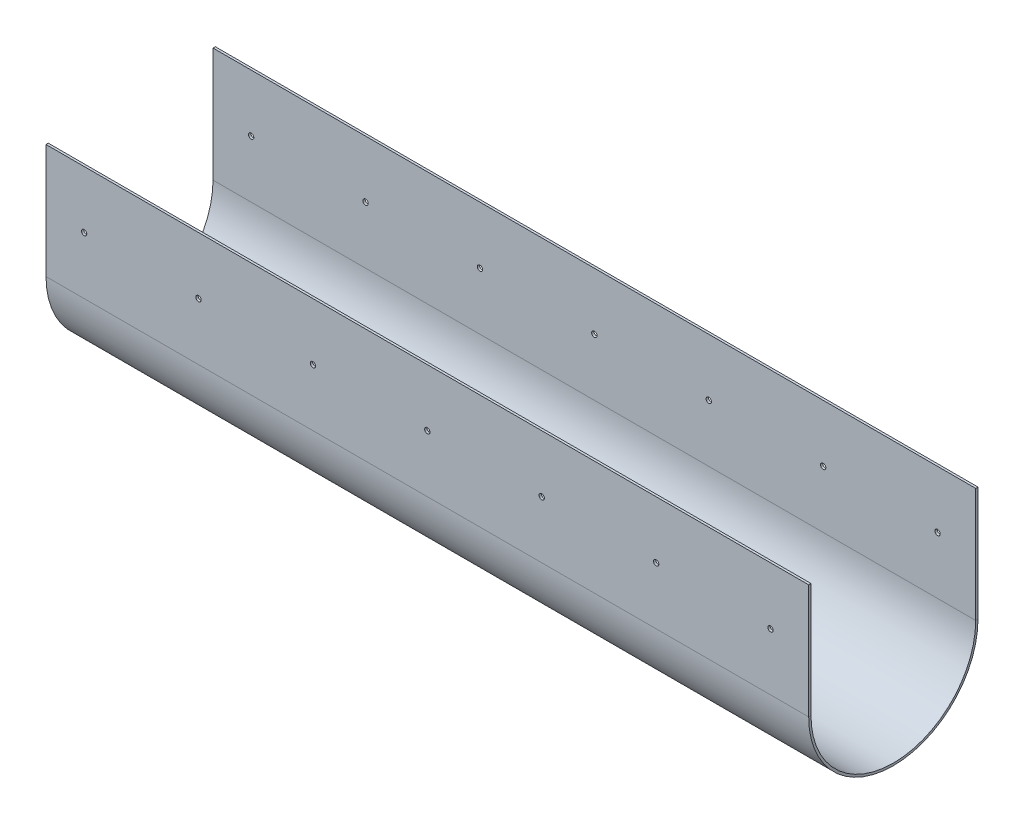
ISO-10303-21;
HEADER;
FILE_DESCRIPTION(('STEP AP214'),'2;1');
FILE_NAME('part.step','',(''),(''),'','','');
FILE_SCHEMA(('AUTOMOTIVE_DESIGN { 1 0 10303 214 1 1 1 1 }'));
ENDSEC;
DATA;
#1=APPLICATION_CONTEXT('core data for automotive mechanical design processes');
#2=APPLICATION_PROTOCOL_DEFINITION('international standard','automotive_design',2000,#1);
#3=PRODUCT_CONTEXT('',#1,'mechanical');
#4=PRODUCT('Part','Part','',(#3));
#5=PRODUCT_RELATED_PRODUCT_CATEGORY('part','',(#4));
#6=PRODUCT_DEFINITION_FORMATION('','',#4);
#7=PRODUCT_DEFINITION_CONTEXT('part definition',#1,'design');
#8=PRODUCT_DEFINITION('design','',#6,#7);
#9=PRODUCT_DEFINITION_SHAPE('','',#8);
#10=(LENGTH_UNIT() NAMED_UNIT(*) SI_UNIT(.MILLI.,.METRE.));
#11=(NAMED_UNIT(*) PLANE_ANGLE_UNIT() SI_UNIT($,.RADIAN.));
#12=(NAMED_UNIT(*) SI_UNIT($,.STERADIAN.) SOLID_ANGLE_UNIT());
#13=UNCERTAINTY_MEASURE_WITH_UNIT(LENGTH_MEASURE(1.E-05),#10,'distance_accuracy_value','');
#14=(GEOMETRIC_REPRESENTATION_CONTEXT(3) GLOBAL_UNCERTAINTY_ASSIGNED_CONTEXT((#13)) GLOBAL_UNIT_ASSIGNED_CONTEXT((#10,
#11,#12)) REPRESENTATION_CONTEXT('',''));
#15=CARTESIAN_POINT('',(0.,0.,0.));
#16=DIRECTION('',(0.,0.,1.));
#17=DIRECTION('',(1.,0.,0.));
#18=AXIS2_PLACEMENT_3D('',#15,#16,#17);
#19=CARTESIAN_POINT('',(500.,0.,108.));
#20=DIRECTION('',(-1.,0.,0.));
#21=DIRECTION('',(0.,1.,0.));
#22=AXIS2_PLACEMENT_3D('',#19,#20,#21);
#23=PLANE('',#22);
#24=DIRECTION('',(0.,0.,-1.));
#25=VECTOR('',#24,1.);
#26=CARTESIAN_POINT('',(500.,150.,108.));
#27=LINE('',#26,#25);
#28=CARTESIAN_POINT('',(500.,150.,111.));
#29=VERTEX_POINT('',#28);
#30=CARTESIAN_POINT('',(500.,150.,108.));
#31=VERTEX_POINT('',#30);
#32=EDGE_CURVE('E14',#29,#31,#27,.T.);
#33=ORIENTED_EDGE('',*,*,#32,.F.);
#34=DIRECTION('',(0.,1.,0.));
#35=VECTOR('',#34,1.);
#36=CARTESIAN_POINT('',(500.,0.,111.));
#37=LINE('',#36,#35);
#38=CARTESIAN_POINT('',(500.,0.,111.));
#39=VERTEX_POINT('',#38);
#40=EDGE_CURVE('E136',#39,#29,#37,.T.);
#41=ORIENTED_EDGE('',*,*,#40,.F.);
#42=DIRECTION('',(0.,0.,-1.));
#43=VECTOR('',#42,1.);
#44=CARTESIAN_POINT('',(500.,0.,108.));
#45=LINE('',#44,#43);
#46=CARTESIAN_POINT('',(500.,0.,108.));
#47=VERTEX_POINT('',#46);
#48=EDGE_CURVE('E75',#39,#47,#45,.T.);
#49=ORIENTED_EDGE('',*,*,#48,.T.);
#50=DIRECTION('',(0.,1.,0.));
#51=VECTOR('',#50,1.);
#52=CARTESIAN_POINT('',(500.,0.,108.));
#53=LINE('',#52,#51);
#54=EDGE_CURVE('E196',#47,#31,#53,.T.);
#55=ORIENTED_EDGE('',*,*,#54,.T.);
#56=EDGE_LOOP('',(#33,#41,#49,#55));
#57=FACE_BOUND('',#56,.T.);
#58=ADVANCED_FACE('F64',(#57),#23,.F.);
#59=CARTESIAN_POINT('',(500.,0.,0.));
#60=DIRECTION('',(-1.,0.,0.));
#61=DIRECTION('',(0.,0.,1.));
#62=AXIS2_PLACEMENT_3D('',#59,#60,#61);
#63=PLANE('',#62);
#64=ORIENTED_EDGE('',*,*,#48,.F.);
#65=CARTESIAN_POINT('',(500.,0.,0.));
#66=DIRECTION('',(1.,0.,0.));
#67=DIRECTION('',(0.,0.,-1.));
#68=AXIS2_PLACEMENT_3D('',#65,#66,#67);
#69=CIRCLE('',#68,111.);
#70=CARTESIAN_POINT('',(500.,0.,-111.));
#71=VERTEX_POINT('',#70);
#72=EDGE_CURVE('E158',#39,#71,#69,.T.);
#73=ORIENTED_EDGE('',*,*,#72,.T.);
#74=DIRECTION('',(0.,0.,1.));
#75=VECTOR('',#74,1.);
#76=CARTESIAN_POINT('',(500.,0.,-108.));
#77=LINE('',#76,#75);
#78=CARTESIAN_POINT('',(500.,0.,-108.));
#79=VERTEX_POINT('',#78);
#80=EDGE_CURVE('E186',#71,#79,#77,.T.);
#81=ORIENTED_EDGE('',*,*,#80,.T.);
#82=CARTESIAN_POINT('',(500.,0.,0.));
#83=DIRECTION('',(1.,0.,0.));
#84=DIRECTION('',(0.,0.,-1.));
#85=AXIS2_PLACEMENT_3D('',#82,#83,#84);
#86=CIRCLE('',#85,108.);
#87=EDGE_CURVE('E209',#47,#79,#86,.T.);
#88=ORIENTED_EDGE('',*,*,#87,.F.);
#89=EDGE_LOOP('',(#64,#73,#81,#88));
#90=FACE_BOUND('',#89,.T.);
#91=ADVANCED_FACE('F210',(#90),#63,.F.);
#92=CARTESIAN_POINT('',(500.,150.,-108.));
#93=DIRECTION('',(-1.,0.,0.));
#94=DIRECTION('',(0.,-1.,0.));
#95=AXIS2_PLACEMENT_3D('',#92,#93,#94);
#96=PLANE('',#95);
#97=ORIENTED_EDGE('',*,*,#80,.F.);
#98=DIRECTION('',(0.,-1.,0.));
#99=VECTOR('',#98,1.);
#100=CARTESIAN_POINT('',(500.,0.,-111.));
#101=LINE('',#100,#99);
#102=CARTESIAN_POINT('',(500.,150.,-111.));
#103=VERTEX_POINT('',#102);
#104=EDGE_CURVE('E163',#103,#71,#101,.T.);
#105=ORIENTED_EDGE('',*,*,#104,.F.);
#106=DIRECTION('',(0.,0.,1.));
#107=VECTOR('',#106,1.);
#108=CARTESIAN_POINT('',(500.,150.,-108.));
#109=LINE('',#108,#107);
#110=CARTESIAN_POINT('',(500.,150.,-108.));
#111=VERTEX_POINT('',#110);
#112=EDGE_CURVE('E183',#103,#111,#109,.T.);
#113=ORIENTED_EDGE('',*,*,#112,.T.);
#114=DIRECTION('',(0.,-1.,0.));
#115=VECTOR('',#114,1.);
#116=CARTESIAN_POINT('',(500.,150.,-108.));
#117=LINE('',#116,#115);
#118=EDGE_CURVE('E129',#111,#79,#117,.T.);
#119=ORIENTED_EDGE('',*,*,#118,.T.);
#120=EDGE_LOOP('',(#97,#105,#113,#119));
#121=FACE_BOUND('',#120,.T.);
#122=ADVANCED_FACE('F277',(#121),#96,.F.);
#123=CARTESIAN_POINT('',(500.,150.,-108.));
#124=DIRECTION('',(0.,1.,0.));
#125=DIRECTION('',(-1.,0.,0.));
#126=AXIS2_PLACEMENT_3D('',#123,#124,#125);
#127=PLANE('',#126);
#128=ORIENTED_EDGE('',*,*,#112,.F.);
#129=DIRECTION('',(1.,0.,0.));
#130=VECTOR('',#129,1.);
#131=CARTESIAN_POINT('',(0.,150.,-111.));
#132=LINE('',#131,#130);
#133=CARTESIAN_POINT('',(-500.,150.,-111.));
#134=VERTEX_POINT('',#133);
#135=EDGE_CURVE('E157',#103,#134,#132,.F.);
#136=ORIENTED_EDGE('',*,*,#135,.T.);
#137=DIRECTION('',(0.,0.,1.));
#138=VECTOR('',#137,1.);
#139=CARTESIAN_POINT('',(-500.,150.,-108.));
#140=LINE('',#139,#138);
#141=CARTESIAN_POINT('',(-500.,150.,-108.));
#142=VERTEX_POINT('',#141);
#143=EDGE_CURVE('E83',#134,#142,#140,.T.);
#144=ORIENTED_EDGE('',*,*,#143,.T.);
#145=DIRECTION('',(-1.,0.,0.));
#146=VECTOR('',#145,1.);
#147=CARTESIAN_POINT('',(500.,150.,-108.));
#148=LINE('',#147,#146);
#149=EDGE_CURVE('E233',#111,#142,#148,.T.);
#150=ORIENTED_EDGE('',*,*,#149,.F.);
#151=EDGE_LOOP('',(#128,#136,#144,#150));
#152=FACE_BOUND('',#151,.T.);
#153=ADVANCED_FACE('F282',(#152),#127,.T.);
#154=CARTESIAN_POINT('',(-500.,150.,-108.));
#155=DIRECTION('',(-1.,0.,0.));
#156=DIRECTION('',(0.,-1.,0.));
#157=AXIS2_PLACEMENT_3D('',#154,#155,#156);
#158=PLANE('',#157);
#159=ORIENTED_EDGE('',*,*,#143,.F.);
#160=DIRECTION('',(0.,-1.,0.));
#161=VECTOR('',#160,1.);
#162=CARTESIAN_POINT('',(-500.,0.,-111.));
#163=LINE('',#162,#161);
#164=CARTESIAN_POINT('',(-500.,0.,-111.));
#165=VERTEX_POINT('',#164);
#166=EDGE_CURVE('E159',#134,#165,#163,.T.);
#167=ORIENTED_EDGE('',*,*,#166,.T.);
#168=DIRECTION('',(0.,0.,1.));
#169=VECTOR('',#168,1.);
#170=CARTESIAN_POINT('',(-500.,0.,-108.));
#171=LINE('',#170,#169);
#172=CARTESIAN_POINT('',(-500.,0.,-108.));
#173=VERTEX_POINT('',#172);
#174=EDGE_CURVE('E177',#165,#173,#171,.T.);
#175=ORIENTED_EDGE('',*,*,#174,.T.);
#176=DIRECTION('',(0.,-1.,0.));
#177=VECTOR('',#176,1.);
#178=CARTESIAN_POINT('',(-500.,150.,-108.));
#179=LINE('',#178,#177);
#180=EDGE_CURVE('E237',#142,#173,#179,.T.);
#181=ORIENTED_EDGE('',*,*,#180,.F.);
#182=EDGE_LOOP('',(#159,#167,#175,#181));
#183=FACE_BOUND('',#182,.T.);
#184=ADVANCED_FACE('F250',(#183),#158,.T.);
#185=CARTESIAN_POINT('',(-500.,0.,0.));
#186=DIRECTION('',(-1.,0.,0.));
#187=DIRECTION('',(0.,0.,1.));
#188=AXIS2_PLACEMENT_3D('',#185,#186,#187);
#189=PLANE('',#188);
#190=ORIENTED_EDGE('',*,*,#174,.F.);
#191=CARTESIAN_POINT('',(-500.,0.,0.));
#192=DIRECTION('',(1.,0.,0.));
#193=DIRECTION('',(0.,0.,-1.));
#194=AXIS2_PLACEMENT_3D('',#191,#192,#193);
#195=CIRCLE('',#194,111.);
#196=CARTESIAN_POINT('',(-500.,0.,111.));
#197=VERTEX_POINT('',#196);
#198=EDGE_CURVE('E153',#197,#165,#195,.T.);
#199=ORIENTED_EDGE('',*,*,#198,.F.);
#200=DIRECTION('',(0.,0.,-1.));
#201=VECTOR('',#200,1.);
#202=CARTESIAN_POINT('',(-500.,0.,108.));
#203=LINE('',#202,#201);
#204=CARTESIAN_POINT('',(-500.,0.,108.));
#205=VERTEX_POINT('',#204);
#206=EDGE_CURVE('E128',#197,#205,#203,.T.);
#207=ORIENTED_EDGE('',*,*,#206,.T.);
#208=CARTESIAN_POINT('',(-500.,0.,0.));
#209=DIRECTION('',(1.,0.,0.));
#210=DIRECTION('',(0.,0.,-1.));
#211=AXIS2_PLACEMENT_3D('',#208,#209,#210);
#212=CIRCLE('',#211,108.);
#213=EDGE_CURVE('E216',#205,#173,#212,.T.);
#214=ORIENTED_EDGE('',*,*,#213,.T.);
#215=EDGE_LOOP('',(#190,#199,#207,#214));
#216=FACE_BOUND('',#215,.T.);
#217=ADVANCED_FACE('F254',(#216),#189,.T.);
#218=CARTESIAN_POINT('',(-500.,0.,108.));
#219=DIRECTION('',(-1.,0.,0.));
#220=DIRECTION('',(0.,1.,0.));
#221=AXIS2_PLACEMENT_3D('',#218,#219,#220);
#222=PLANE('',#221);
#223=ORIENTED_EDGE('',*,*,#206,.F.);
#224=DIRECTION('',(0.,1.,0.));
#225=VECTOR('',#224,1.);
#226=CARTESIAN_POINT('',(-500.,0.,111.));
#227=LINE('',#226,#225);
#228=CARTESIAN_POINT('',(-500.,150.,111.));
#229=VERTEX_POINT('',#228);
#230=EDGE_CURVE('E134',#197,#229,#227,.T.);
#231=ORIENTED_EDGE('',*,*,#230,.T.);
#232=DIRECTION('',(0.,0.,-1.));
#233=VECTOR('',#232,1.);
#234=CARTESIAN_POINT('',(-500.,150.,108.));
#235=LINE('',#234,#233);
#236=CARTESIAN_POINT('',(-500.,150.,108.));
#237=VERTEX_POINT('',#236);
#238=EDGE_CURVE('E68',#229,#237,#235,.T.);
#239=ORIENTED_EDGE('',*,*,#238,.T.);
#240=DIRECTION('',(0.,1.,0.));
#241=VECTOR('',#240,1.);
#242=CARTESIAN_POINT('',(-500.,0.,108.));
#243=LINE('',#242,#241);
#244=EDGE_CURVE('E222',#205,#237,#243,.T.);
#245=ORIENTED_EDGE('',*,*,#244,.F.);
#246=EDGE_LOOP('',(#223,#231,#239,#245));
#247=FACE_BOUND('',#246,.T.);
#248=ADVANCED_FACE('F139',(#247),#222,.T.);
#249=CARTESIAN_POINT('',(500.,150.,108.));
#250=DIRECTION('',(0.,-1.,0.));
#251=DIRECTION('',(-1.,0.,0.));
#252=AXIS2_PLACEMENT_3D('',#249,#250,#251);
#253=PLANE('',#252);
#254=DIRECTION('',(-1.,0.,0.));
#255=VECTOR('',#254,1.);
#256=CARTESIAN_POINT('',(0.,150.,111.));
#257=LINE('',#256,#255);
#258=EDGE_CURVE('E119',#29,#229,#257,.T.);
#259=ORIENTED_EDGE('',*,*,#258,.F.);
#260=ORIENTED_EDGE('',*,*,#32,.T.);
#261=DIRECTION('',(-1.,0.,0.));
#262=VECTOR('',#261,1.);
#263=CARTESIAN_POINT('',(500.,150.,108.));
#264=LINE('',#263,#262);
#265=EDGE_CURVE('E122',#31,#237,#264,.T.);
#266=ORIENTED_EDGE('',*,*,#265,.T.);
#267=ORIENTED_EDGE('',*,*,#238,.F.);
#268=EDGE_LOOP('',(#259,#260,#266,#267));
#269=FACE_BOUND('',#268,.T.);
#270=ADVANCED_FACE('F66',(#269),#253,.F.);
#271=CARTESIAN_POINT('',(0.,0.,108.));
#272=DIRECTION('',(0.,0.,-1.));
#273=DIRECTION('',(-1.,0.,0.));
#274=AXIS2_PLACEMENT_3D('',#271,#272,#273);
#275=PLANE('',#274);
#276=CARTESIAN_POINT('',(450.,74.9999999999999,108.));
#277=DIRECTION('',(0.,0.,-1.));
#278=DIRECTION('',(-1.,0.,0.));
#279=AXIS2_PLACEMENT_3D('',#276,#277,#278);
#280=CIRCLE('',#279,3.50000000000002);
#281=CARTESIAN_POINT('',(446.5,74.9999999999999,108.));
#282=VERTEX_POINT('',#281);
#283=EDGE_CURVE('E148',#282,#282,#280,.T.);
#284=ORIENTED_EDGE('',*,*,#283,.F.);
#285=EDGE_LOOP('',(#284));
#286=FACE_BOUND('',#285,.T.);
#287=CARTESIAN_POINT('',(300.,74.9999999999999,108.));
#288=DIRECTION('',(0.,0.,-1.));
#289=DIRECTION('',(-1.,0.,0.));
#290=AXIS2_PLACEMENT_3D('',#287,#288,#289);
#291=CIRCLE('',#290,3.50000000000002);
#292=CARTESIAN_POINT('',(296.5,74.9999999999999,108.));
#293=VERTEX_POINT('',#292);
#294=EDGE_CURVE('E379',#293,#293,#291,.T.);
#295=ORIENTED_EDGE('',*,*,#294,.F.);
#296=EDGE_LOOP('',(#295));
#297=FACE_BOUND('',#296,.T.);
#298=CARTESIAN_POINT('',(150.,74.9999999999999,108.));
#299=DIRECTION('',(0.,0.,-1.));
#300=DIRECTION('',(-1.,0.,0.));
#301=AXIS2_PLACEMENT_3D('',#298,#299,#300);
#302=CIRCLE('',#301,3.49999999999999);
#303=CARTESIAN_POINT('',(146.5,74.9999999999999,108.));
#304=VERTEX_POINT('',#303);
#305=EDGE_CURVE('E373',#304,#304,#302,.T.);
#306=ORIENTED_EDGE('',*,*,#305,.F.);
#307=EDGE_LOOP('',(#306));
#308=FACE_BOUND('',#307,.T.);
#309=CARTESIAN_POINT('',(0.,74.9999999999999,108.));
#310=DIRECTION('',(0.,0.,-1.));
#311=DIRECTION('',(-1.,0.,0.));
#312=AXIS2_PLACEMENT_3D('',#309,#310,#311);
#313=CIRCLE('',#312,3.5);
#314=CARTESIAN_POINT('',(-3.49999999999995,74.9999999999999,108.));
#315=VERTEX_POINT('',#314);
#316=EDGE_CURVE('E367',#315,#315,#313,.T.);
#317=ORIENTED_EDGE('',*,*,#316,.F.);
#318=EDGE_LOOP('',(#317));
#319=FACE_BOUND('',#318,.T.);
#320=CARTESIAN_POINT('',(-150.,74.9999999999999,108.));
#321=DIRECTION('',(0.,0.,-1.));
#322=DIRECTION('',(-1.,0.,0.));
#323=AXIS2_PLACEMENT_3D('',#320,#321,#322);
#324=CIRCLE('',#323,3.49999999999999);
#325=CARTESIAN_POINT('',(-153.5,74.9999999999999,108.));
#326=VERTEX_POINT('',#325);
#327=EDGE_CURVE('E361',#326,#326,#324,.T.);
#328=ORIENTED_EDGE('',*,*,#327,.F.);
#329=EDGE_LOOP('',(#328));
#330=FACE_BOUND('',#329,.T.);
#331=CARTESIAN_POINT('',(-300.,74.9999999999998,108.));
#332=DIRECTION('',(0.,0.,-1.));
#333=DIRECTION('',(-1.,0.,0.));
#334=AXIS2_PLACEMENT_3D('',#331,#332,#333);
#335=CIRCLE('',#334,3.50000000000002);
#336=CARTESIAN_POINT('',(-303.5,74.9999999999998,108.));
#337=VERTEX_POINT('',#336);
#338=EDGE_CURVE('E355',#337,#337,#335,.T.);
#339=ORIENTED_EDGE('',*,*,#338,.F.);
#340=EDGE_LOOP('',(#339));
#341=FACE_BOUND('',#340,.T.);
#342=CARTESIAN_POINT('',(-450.,74.9999999999998,108.));
#343=DIRECTION('',(0.,0.,-1.));
#344=DIRECTION('',(-1.,0.,0.));
#345=AXIS2_PLACEMENT_3D('',#342,#343,#344);
#346=CIRCLE('',#345,3.50000000000002);
#347=CARTESIAN_POINT('',(-453.5,74.9999999999998,108.));
#348=VERTEX_POINT('',#347);
#349=EDGE_CURVE('E337',#348,#348,#346,.T.);
#350=ORIENTED_EDGE('',*,*,#349,.F.);
#351=EDGE_LOOP('',(#350));
#352=FACE_BOUND('',#351,.T.);
#353=DIRECTION('',(-1.,0.,0.));
#354=VECTOR('',#353,1.);
#355=CARTESIAN_POINT('',(500.,0.,108.));
#356=LINE('',#355,#354);
#357=EDGE_CURVE('E169',#47,#205,#356,.T.);
#358=ORIENTED_EDGE('',*,*,#357,.T.);
#359=ORIENTED_EDGE('',*,*,#244,.T.);
#360=ORIENTED_EDGE('',*,*,#265,.F.);
#361=ORIENTED_EDGE('',*,*,#54,.F.);
#362=EDGE_LOOP('',(#358,#359,#360,#361));
#363=FACE_BOUND('',#362,.T.);
#364=ADVANCED_FACE('F202',(#286,#297,#308,#319,#330,#341,#352,#363),#275,.T.);
#365=CARTESIAN_POINT('',(500.,0.,0.));
#366=DIRECTION('',(1.,0.,0.));
#367=DIRECTION('',(0.,0.,-1.));
#368=AXIS2_PLACEMENT_3D('',#365,#366,#367);
#369=CYLINDRICAL_SURFACE('',#368,108.);
#370=DIRECTION('',(-1.,0.,0.));
#371=VECTOR('',#370,1.);
#372=CARTESIAN_POINT('',(500.,0.,-108.));
#373=LINE('',#372,#371);
#374=EDGE_CURVE('E206',#79,#173,#373,.T.);
#375=ORIENTED_EDGE('',*,*,#374,.T.);
#376=ORIENTED_EDGE('',*,*,#213,.F.);
#377=ORIENTED_EDGE('',*,*,#357,.F.);
#378=ORIENTED_EDGE('',*,*,#87,.T.);
#379=EDGE_LOOP('',(#375,#376,#377,#378));
#380=FACE_BOUND('',#379,.T.);
#381=ADVANCED_FACE('F219',(#380),#369,.F.);
#382=CARTESIAN_POINT('',(0.,0.,-108.));
#383=DIRECTION('',(0.,0.,1.));
#384=DIRECTION('',(0.,-1.,0.));
#385=AXIS2_PLACEMENT_3D('',#382,#383,#384);
#386=PLANE('',#385);
#387=CARTESIAN_POINT('',(450.,74.9999999999999,-108.));
#388=DIRECTION('',(0.,0.,1.));
#389=DIRECTION('',(0.,-1.,0.));
#390=AXIS2_PLACEMENT_3D('',#387,#388,#389);
#391=CIRCLE('',#390,3.50000000000002);
#392=CARTESIAN_POINT('',(450.,71.4999999999999,-108.));
#393=VERTEX_POINT('',#392);
#394=EDGE_CURVE('E311',#393,#393,#391,.T.);
#395=ORIENTED_EDGE('',*,*,#394,.F.);
#396=EDGE_LOOP('',(#395));
#397=FACE_BOUND('',#396,.T.);
#398=CARTESIAN_POINT('',(300.,74.9999999999999,-108.));
#399=DIRECTION('',(0.,0.,1.));
#400=DIRECTION('',(0.,-1.,0.));
#401=AXIS2_PLACEMENT_3D('',#398,#399,#400);
#402=CIRCLE('',#401,3.50000000000002);
#403=CARTESIAN_POINT('',(300.,71.4999999999999,-108.));
#404=VERTEX_POINT('',#403);
#405=EDGE_CURVE('E315',#404,#404,#402,.T.);
#406=ORIENTED_EDGE('',*,*,#405,.F.);
#407=EDGE_LOOP('',(#406));
#408=FACE_BOUND('',#407,.T.);
#409=CARTESIAN_POINT('',(150.,74.9999999999999,-108.));
#410=DIRECTION('',(0.,0.,1.));
#411=DIRECTION('',(0.,-1.,0.));
#412=AXIS2_PLACEMENT_3D('',#409,#410,#411);
#413=CIRCLE('',#412,3.49999999999999);
#414=CARTESIAN_POINT('',(150.,71.4999999999999,-108.));
#415=VERTEX_POINT('',#414);
#416=EDGE_CURVE('E319',#415,#415,#413,.T.);
#417=ORIENTED_EDGE('',*,*,#416,.F.);
#418=EDGE_LOOP('',(#417));
#419=FACE_BOUND('',#418,.T.);
#420=CARTESIAN_POINT('',(0.,74.9999999999999,-108.));
#421=DIRECTION('',(0.,0.,1.));
#422=DIRECTION('',(0.,-1.,0.));
#423=AXIS2_PLACEMENT_3D('',#420,#421,#422);
#424=CIRCLE('',#423,3.5);
#425=CARTESIAN_POINT('',(0.,71.4999999999999,-108.));
#426=VERTEX_POINT('',#425);
#427=EDGE_CURVE('E323',#426,#426,#424,.T.);
#428=ORIENTED_EDGE('',*,*,#427,.F.);
#429=EDGE_LOOP('',(#428));
#430=FACE_BOUND('',#429,.T.);
#431=CARTESIAN_POINT('',(-150.,74.9999999999999,-108.));
#432=DIRECTION('',(0.,0.,1.));
#433=DIRECTION('',(0.,-1.,0.));
#434=AXIS2_PLACEMENT_3D('',#431,#432,#433);
#435=CIRCLE('',#434,3.49999999999999);
#436=CARTESIAN_POINT('',(-150.,71.4999999999999,-108.));
#437=VERTEX_POINT('',#436);
#438=EDGE_CURVE('E327',#437,#437,#435,.T.);
#439=ORIENTED_EDGE('',*,*,#438,.F.);
#440=EDGE_LOOP('',(#439));
#441=FACE_BOUND('',#440,.T.);
#442=CARTESIAN_POINT('',(-300.,74.9999999999998,-108.));
#443=DIRECTION('',(0.,0.,1.));
#444=DIRECTION('',(0.,-1.,0.));
#445=AXIS2_PLACEMENT_3D('',#442,#443,#444);
#446=CIRCLE('',#445,3.50000000000002);
#447=CARTESIAN_POINT('',(-300.,71.4999999999998,-108.));
#448=VERTEX_POINT('',#447);
#449=EDGE_CURVE('E331',#448,#448,#446,.T.);
#450=ORIENTED_EDGE('',*,*,#449,.F.);
#451=EDGE_LOOP('',(#450));
#452=FACE_BOUND('',#451,.T.);
#453=CARTESIAN_POINT('',(-450.,74.9999999999998,-108.));
#454=DIRECTION('',(0.,0.,1.));
#455=DIRECTION('',(0.,-1.,0.));
#456=AXIS2_PLACEMENT_3D('',#453,#454,#455);
#457=CIRCLE('',#456,3.50000000000002);
#458=CARTESIAN_POINT('',(-450.,71.4999999999998,-108.));
#459=VERTEX_POINT('',#458);
#460=EDGE_CURVE('E334',#459,#459,#457,.T.);
#461=ORIENTED_EDGE('',*,*,#460,.F.);
#462=EDGE_LOOP('',(#461));
#463=FACE_BOUND('',#462,.T.);
#464=ORIENTED_EDGE('',*,*,#149,.T.);
#465=ORIENTED_EDGE('',*,*,#180,.T.);
#466=ORIENTED_EDGE('',*,*,#374,.F.);
#467=ORIENTED_EDGE('',*,*,#118,.F.);
#468=EDGE_LOOP('',(#464,#465,#466,#467));
#469=FACE_BOUND('',#468,.T.);
#470=ADVANCED_FACE('F247',(#397,#408,#419,#430,#441,#452,#463,#469),#386,.T.);
#471=CARTESIAN_POINT('',(0.,0.,111.));
#472=DIRECTION('',(0.,0.,-1.));
#473=DIRECTION('',(-1.,0.,0.));
#474=AXIS2_PLACEMENT_3D('',#471,#472,#473);
#475=PLANE('',#474);
#476=CARTESIAN_POINT('',(450.,74.9999999999999,111.));
#477=DIRECTION('',(0.,0.,1.));
#478=DIRECTION('',(1.,0.,0.));
#479=AXIS2_PLACEMENT_3D('',#476,#477,#478);
#480=CIRCLE('',#479,3.50000000000002);
#481=CARTESIAN_POINT('',(453.5,74.9999999999999,111.));
#482=VERTEX_POINT('',#481);
#483=EDGE_CURVE('E347',#482,#482,#480,.T.);
#484=ORIENTED_EDGE('',*,*,#483,.F.);
#485=EDGE_LOOP('',(#484));
#486=FACE_BOUND('',#485,.T.);
#487=CARTESIAN_POINT('',(300.,74.9999999999999,111.));
#488=DIRECTION('',(0.,0.,1.));
#489=DIRECTION('',(1.,0.,0.));
#490=AXIS2_PLACEMENT_3D('',#487,#488,#489);
#491=CIRCLE('',#490,3.50000000000002);
#492=CARTESIAN_POINT('',(303.5,74.9999999999999,111.));
#493=VERTEX_POINT('',#492);
#494=EDGE_CURVE('E410',#493,#493,#491,.T.);
#495=ORIENTED_EDGE('',*,*,#494,.F.);
#496=EDGE_LOOP('',(#495));
#497=FACE_BOUND('',#496,.T.);
#498=CARTESIAN_POINT('',(150.,74.9999999999999,111.));
#499=DIRECTION('',(0.,0.,1.));
#500=DIRECTION('',(1.,0.,0.));
#501=AXIS2_PLACEMENT_3D('',#498,#499,#500);
#502=CIRCLE('',#501,3.49999999999999);
#503=CARTESIAN_POINT('',(153.5,74.9999999999999,111.));
#504=VERTEX_POINT('',#503);
#505=EDGE_CURVE('E453',#504,#504,#502,.T.);
#506=ORIENTED_EDGE('',*,*,#505,.F.);
#507=EDGE_LOOP('',(#506));
#508=FACE_BOUND('',#507,.T.);
#509=CARTESIAN_POINT('',(0.,74.9999999999999,111.));
#510=DIRECTION('',(0.,0.,1.));
#511=DIRECTION('',(1.,0.,0.));
#512=AXIS2_PLACEMENT_3D('',#509,#510,#511);
#513=CIRCLE('',#512,3.5);
#514=CARTESIAN_POINT('',(3.50000000000006,74.9999999999999,111.));
#515=VERTEX_POINT('',#514);
#516=EDGE_CURVE('E454',#515,#515,#513,.T.);
#517=ORIENTED_EDGE('',*,*,#516,.F.);
#518=EDGE_LOOP('',(#517));
#519=FACE_BOUND('',#518,.T.);
#520=CARTESIAN_POINT('',(-150.,74.9999999999999,111.));
#521=DIRECTION('',(0.,0.,1.));
#522=DIRECTION('',(1.,0.,0.));
#523=AXIS2_PLACEMENT_3D('',#520,#521,#522);
#524=CIRCLE('',#523,3.49999999999999);
#525=CARTESIAN_POINT('',(-146.5,74.9999999999999,111.));
#526=VERTEX_POINT('',#525);
#527=EDGE_CURVE('E509',#526,#526,#524,.T.);
#528=ORIENTED_EDGE('',*,*,#527,.F.);
#529=EDGE_LOOP('',(#528));
#530=FACE_BOUND('',#529,.T.);
#531=CARTESIAN_POINT('',(-300.,74.9999999999998,111.));
#532=DIRECTION('',(0.,0.,1.));
#533=DIRECTION('',(1.,0.,0.));
#534=AXIS2_PLACEMENT_3D('',#531,#532,#533);
#535=CIRCLE('',#534,3.50000000000002);
#536=CARTESIAN_POINT('',(-296.5,74.9999999999998,111.));
#537=VERTEX_POINT('',#536);
#538=EDGE_CURVE('E403',#537,#537,#535,.T.);
#539=ORIENTED_EDGE('',*,*,#538,.F.);
#540=EDGE_LOOP('',(#539));
#541=FACE_BOUND('',#540,.T.);
#542=CARTESIAN_POINT('',(-450.,74.9999999999998,111.));
#543=DIRECTION('',(0.,0.,1.));
#544=DIRECTION('',(1.,0.,0.));
#545=AXIS2_PLACEMENT_3D('',#542,#543,#544);
#546=CIRCLE('',#545,3.50000000000002);
#547=CARTESIAN_POINT('',(-446.5,74.9999999999998,111.));
#548=VERTEX_POINT('',#547);
#549=EDGE_CURVE('E350',#548,#548,#546,.T.);
#550=ORIENTED_EDGE('',*,*,#549,.F.);
#551=EDGE_LOOP('',(#550));
#552=FACE_BOUND('',#551,.T.);
#553=DIRECTION('',(-1.,0.,0.));
#554=VECTOR('',#553,1.);
#555=CARTESIAN_POINT('',(0.,0.,111.));
#556=LINE('',#555,#554);
#557=EDGE_CURVE('E143',#39,#197,#556,.T.);
#558=ORIENTED_EDGE('',*,*,#557,.F.);
#559=ORIENTED_EDGE('',*,*,#40,.T.);
#560=ORIENTED_EDGE('',*,*,#258,.T.);
#561=ORIENTED_EDGE('',*,*,#230,.F.);
#562=EDGE_LOOP('',(#558,#559,#560,#561));
#563=FACE_BOUND('',#562,.T.);
#564=ADVANCED_FACE('F133',(#486,#497,#508,#519,#530,#541,#552,#563),#475,.F.);
#565=CARTESIAN_POINT('',(500.,0.,0.));
#566=DIRECTION('',(1.,0.,0.));
#567=DIRECTION('',(0.,0.,-1.));
#568=AXIS2_PLACEMENT_3D('',#565,#566,#567);
#569=CYLINDRICAL_SURFACE('',#568,111.);
#570=DIRECTION('',(1.,0.,0.));
#571=VECTOR('',#570,1.);
#572=CARTESIAN_POINT('',(500.,0.,-111.));
#573=LINE('',#572,#571);
#574=EDGE_CURVE('E152',#71,#165,#573,.F.);
#575=ORIENTED_EDGE('',*,*,#574,.F.);
#576=ORIENTED_EDGE('',*,*,#72,.F.);
#577=ORIENTED_EDGE('',*,*,#557,.T.);
#578=ORIENTED_EDGE('',*,*,#198,.T.);
#579=EDGE_LOOP('',(#575,#576,#577,#578));
#580=FACE_BOUND('',#579,.T.);
#581=ADVANCED_FACE('F263',(#580),#569,.T.);
#582=CARTESIAN_POINT('',(0.,0.,-111.));
#583=DIRECTION('',(0.,0.,1.));
#584=DIRECTION('',(0.,-1.,0.));
#585=AXIS2_PLACEMENT_3D('',#582,#583,#584);
#586=PLANE('',#585);
#587=CARTESIAN_POINT('',(450.,74.9999999999999,-111.));
#588=DIRECTION('',(0.,0.,1.));
#589=DIRECTION('',(1.,0.,0.));
#590=AXIS2_PLACEMENT_3D('',#587,#588,#589);
#591=CIRCLE('',#590,3.50000000000002);
#592=CARTESIAN_POINT('',(453.5,74.9999999999999,-111.));
#593=VERTEX_POINT('',#592);
#594=EDGE_CURVE('E338',#593,#593,#591,.T.);
#595=ORIENTED_EDGE('',*,*,#594,.T.);
#596=EDGE_LOOP('',(#595));
#597=FACE_BOUND('',#596,.T.);
#598=CARTESIAN_POINT('',(300.,74.9999999999999,-111.));
#599=DIRECTION('',(0.,0.,1.));
#600=DIRECTION('',(1.,0.,0.));
#601=AXIS2_PLACEMENT_3D('',#598,#599,#600);
#602=CIRCLE('',#601,3.50000000000002);
#603=CARTESIAN_POINT('',(303.5,74.9999999999999,-111.));
#604=VERTEX_POINT('',#603);
#605=EDGE_CURVE('E414',#604,#604,#602,.T.);
#606=ORIENTED_EDGE('',*,*,#605,.T.);
#607=EDGE_LOOP('',(#606));
#608=FACE_BOUND('',#607,.T.);
#609=CARTESIAN_POINT('',(150.,74.9999999999999,-111.));
#610=DIRECTION('',(0.,0.,1.));
#611=DIRECTION('',(1.,0.,0.));
#612=AXIS2_PLACEMENT_3D('',#609,#610,#611);
#613=CIRCLE('',#612,3.49999999999999);
#614=CARTESIAN_POINT('',(153.5,74.9999999999999,-111.));
#615=VERTEX_POINT('',#614);
#616=EDGE_CURVE('E450',#615,#615,#613,.T.);
#617=ORIENTED_EDGE('',*,*,#616,.T.);
#618=EDGE_LOOP('',(#617));
#619=FACE_BOUND('',#618,.T.);
#620=CARTESIAN_POINT('',(0.,74.9999999999999,-111.));
#621=DIRECTION('',(0.,0.,1.));
#622=DIRECTION('',(1.,0.,0.));
#623=AXIS2_PLACEMENT_3D('',#620,#621,#622);
#624=CIRCLE('',#623,3.5);
#625=CARTESIAN_POINT('',(3.50000000000006,74.9999999999999,-111.));
#626=VERTEX_POINT('',#625);
#627=EDGE_CURVE('E491',#626,#626,#624,.T.);
#628=ORIENTED_EDGE('',*,*,#627,.T.);
#629=EDGE_LOOP('',(#628));
#630=FACE_BOUND('',#629,.T.);
#631=CARTESIAN_POINT('',(-150.,74.9999999999999,-111.));
#632=DIRECTION('',(0.,0.,1.));
#633=DIRECTION('',(1.,0.,0.));
#634=AXIS2_PLACEMENT_3D('',#631,#632,#633);
#635=CIRCLE('',#634,3.49999999999999);
#636=CARTESIAN_POINT('',(-146.5,74.9999999999999,-111.));
#637=VERTEX_POINT('',#636);
#638=EDGE_CURVE('E425',#637,#637,#635,.T.);
#639=ORIENTED_EDGE('',*,*,#638,.T.);
#640=EDGE_LOOP('',(#639));
#641=FACE_BOUND('',#640,.T.);
#642=CARTESIAN_POINT('',(-300.,74.9999999999998,-111.));
#643=DIRECTION('',(0.,0.,1.));
#644=DIRECTION('',(1.,0.,0.));
#645=AXIS2_PLACEMENT_3D('',#642,#643,#644);
#646=CIRCLE('',#645,3.50000000000002);
#647=CARTESIAN_POINT('',(-296.5,74.9999999999998,-111.));
#648=VERTEX_POINT('',#647);
#649=EDGE_CURVE('E399',#648,#648,#646,.T.);
#650=ORIENTED_EDGE('',*,*,#649,.T.);
#651=EDGE_LOOP('',(#650));
#652=FACE_BOUND('',#651,.T.);
#653=CARTESIAN_POINT('',(-450.,74.9999999999998,-111.));
#654=DIRECTION('',(0.,0.,1.));
#655=DIRECTION('',(1.,0.,0.));
#656=AXIS2_PLACEMENT_3D('',#653,#654,#655);
#657=CIRCLE('',#656,3.50000000000002);
#658=CARTESIAN_POINT('',(-446.5,74.9999999999998,-111.));
#659=VERTEX_POINT('',#658);
#660=EDGE_CURVE('E437',#659,#659,#657,.T.);
#661=ORIENTED_EDGE('',*,*,#660,.T.);
#662=EDGE_LOOP('',(#661));
#663=FACE_BOUND('',#662,.T.);
#664=ORIENTED_EDGE('',*,*,#135,.F.);
#665=ORIENTED_EDGE('',*,*,#104,.T.);
#666=ORIENTED_EDGE('',*,*,#574,.T.);
#667=ORIENTED_EDGE('',*,*,#166,.F.);
#668=EDGE_LOOP('',(#664,#665,#666,#667));
#669=FACE_BOUND('',#668,.T.);
#670=ADVANCED_FACE('F258',(#597,#608,#619,#630,#641,#652,#663,#669),#586,.F.);
#671=CARTESIAN_POINT('',(-450.,74.9999999999998,-111.));
#672=DIRECTION('',(0.,0.,1.));
#673=DIRECTION('',(1.,0.,0.));
#674=AXIS2_PLACEMENT_3D('',#671,#672,#673);
#675=CYLINDRICAL_SURFACE('',#674,3.50000000000002);
#676=ORIENTED_EDGE('',*,*,#460,.T.);
#677=EDGE_LOOP('',(#676));
#678=FACE_BOUND('',#677,.T.);
#679=ORIENTED_EDGE('',*,*,#660,.F.);
#680=EDGE_LOOP('',(#679));
#681=FACE_BOUND('',#680,.T.);
#682=ADVANCED_FACE('F269',(#678,#681),#675,.F.);
#683=CARTESIAN_POINT('',(-300.,74.9999999999998,-111.));
#684=DIRECTION('',(0.,0.,1.));
#685=DIRECTION('',(1.,0.,0.));
#686=AXIS2_PLACEMENT_3D('',#683,#684,#685);
#687=CYLINDRICAL_SURFACE('',#686,3.50000000000002);
#688=ORIENTED_EDGE('',*,*,#449,.T.);
#689=EDGE_LOOP('',(#688));
#690=FACE_BOUND('',#689,.T.);
#691=ORIENTED_EDGE('',*,*,#649,.F.);
#692=EDGE_LOOP('',(#691));
#693=FACE_BOUND('',#692,.T.);
#694=ADVANCED_FACE('F554',(#690,#693),#687,.F.);
#695=CARTESIAN_POINT('',(-150.,74.9999999999999,-111.));
#696=DIRECTION('',(0.,0.,1.));
#697=DIRECTION('',(1.,0.,0.));
#698=AXIS2_PLACEMENT_3D('',#695,#696,#697);
#699=CYLINDRICAL_SURFACE('',#698,3.49999999999999);
#700=ORIENTED_EDGE('',*,*,#438,.T.);
#701=EDGE_LOOP('',(#700));
#702=FACE_BOUND('',#701,.T.);
#703=ORIENTED_EDGE('',*,*,#638,.F.);
#704=EDGE_LOOP('',(#703));
#705=FACE_BOUND('',#704,.T.);
#706=ADVANCED_FACE('F562',(#702,#705),#699,.F.);
#707=CARTESIAN_POINT('',(0.,74.9999999999999,-111.));
#708=DIRECTION('',(0.,0.,1.));
#709=DIRECTION('',(1.,0.,0.));
#710=AXIS2_PLACEMENT_3D('',#707,#708,#709);
#711=CYLINDRICAL_SURFACE('',#710,3.5);
#712=ORIENTED_EDGE('',*,*,#427,.T.);
#713=EDGE_LOOP('',(#712));
#714=FACE_BOUND('',#713,.T.);
#715=ORIENTED_EDGE('',*,*,#627,.F.);
#716=EDGE_LOOP('',(#715));
#717=FACE_BOUND('',#716,.T.);
#718=ADVANCED_FACE('F569',(#714,#717),#711,.F.);
#719=CARTESIAN_POINT('',(150.,74.9999999999999,-111.));
#720=DIRECTION('',(0.,0.,1.));
#721=DIRECTION('',(1.,0.,0.));
#722=AXIS2_PLACEMENT_3D('',#719,#720,#721);
#723=CYLINDRICAL_SURFACE('',#722,3.49999999999999);
#724=ORIENTED_EDGE('',*,*,#416,.T.);
#725=EDGE_LOOP('',(#724));
#726=FACE_BOUND('',#725,.T.);
#727=ORIENTED_EDGE('',*,*,#616,.F.);
#728=EDGE_LOOP('',(#727));
#729=FACE_BOUND('',#728,.T.);
#730=ADVANCED_FACE('F576',(#726,#729),#723,.F.);
#731=CARTESIAN_POINT('',(300.,74.9999999999999,-111.));
#732=DIRECTION('',(0.,0.,1.));
#733=DIRECTION('',(1.,0.,0.));
#734=AXIS2_PLACEMENT_3D('',#731,#732,#733);
#735=CYLINDRICAL_SURFACE('',#734,3.50000000000002);
#736=ORIENTED_EDGE('',*,*,#405,.T.);
#737=EDGE_LOOP('',(#736));
#738=FACE_BOUND('',#737,.T.);
#739=ORIENTED_EDGE('',*,*,#605,.F.);
#740=EDGE_LOOP('',(#739));
#741=FACE_BOUND('',#740,.T.);
#742=ADVANCED_FACE('F555',(#738,#741),#735,.F.);
#743=CARTESIAN_POINT('',(450.,74.9999999999999,-111.));
#744=DIRECTION('',(0.,0.,1.));
#745=DIRECTION('',(1.,0.,0.));
#746=AXIS2_PLACEMENT_3D('',#743,#744,#745);
#747=CYLINDRICAL_SURFACE('',#746,3.50000000000002);
#748=ORIENTED_EDGE('',*,*,#394,.T.);
#749=EDGE_LOOP('',(#748));
#750=FACE_BOUND('',#749,.T.);
#751=ORIENTED_EDGE('',*,*,#594,.F.);
#752=EDGE_LOOP('',(#751));
#753=FACE_BOUND('',#752,.T.);
#754=ADVANCED_FACE('F548',(#750,#753),#747,.F.);
#755=ORIENTED_EDGE('',*,*,#349,.T.);
#756=EDGE_LOOP('',(#755));
#757=FACE_BOUND('',#756,.T.);
#758=ORIENTED_EDGE('',*,*,#549,.T.);
#759=EDGE_LOOP('',(#758));
#760=FACE_BOUND('',#759,.T.);
#761=ADVANCED_FACE('F545',(#757,#760),#675,.F.);
#762=ORIENTED_EDGE('',*,*,#338,.T.);
#763=EDGE_LOOP('',(#762));
#764=FACE_BOUND('',#763,.T.);
#765=ORIENTED_EDGE('',*,*,#538,.T.);
#766=EDGE_LOOP('',(#765));
#767=FACE_BOUND('',#766,.T.);
#768=ADVANCED_FACE('F547',(#764,#767),#687,.F.);
#769=ORIENTED_EDGE('',*,*,#327,.T.);
#770=EDGE_LOOP('',(#769));
#771=FACE_BOUND('',#770,.T.);
#772=ORIENTED_EDGE('',*,*,#527,.T.);
#773=EDGE_LOOP('',(#772));
#774=FACE_BOUND('',#773,.T.);
#775=ADVANCED_FACE('F520',(#771,#774),#699,.F.);
#776=ORIENTED_EDGE('',*,*,#316,.T.);
#777=EDGE_LOOP('',(#776));
#778=FACE_BOUND('',#777,.T.);
#779=ORIENTED_EDGE('',*,*,#516,.T.);
#780=EDGE_LOOP('',(#779));
#781=FACE_BOUND('',#780,.T.);
#782=ADVANCED_FACE('F578',(#778,#781),#711,.F.);
#783=ORIENTED_EDGE('',*,*,#305,.T.);
#784=EDGE_LOOP('',(#783));
#785=FACE_BOUND('',#784,.T.);
#786=ORIENTED_EDGE('',*,*,#505,.T.);
#787=EDGE_LOOP('',(#786));
#788=FACE_BOUND('',#787,.T.);
#789=ADVANCED_FACE('F582',(#785,#788),#723,.F.);
#790=ORIENTED_EDGE('',*,*,#294,.T.);
#791=EDGE_LOOP('',(#790));
#792=FACE_BOUND('',#791,.T.);
#793=ORIENTED_EDGE('',*,*,#494,.T.);
#794=EDGE_LOOP('',(#793));
#795=FACE_BOUND('',#794,.T.);
#796=ADVANCED_FACE('F585',(#792,#795),#735,.F.);
#797=ORIENTED_EDGE('',*,*,#283,.T.);
#798=EDGE_LOOP('',(#797));
#799=FACE_BOUND('',#798,.T.);
#800=ORIENTED_EDGE('',*,*,#483,.T.);
#801=EDGE_LOOP('',(#800));
#802=FACE_BOUND('',#801,.T.);
#803=ADVANCED_FACE('F558',(#799,#802),#747,.F.);
#804=CLOSED_SHELL('',(#58,#91,#122,#153,#184,#217,#248,#270,#364,#381,#470,#564,#581,#670,#682,
#694,#706,#718,#730,#742,#754,#761,#768,#775,#782,#789,#796,#803));
#805=MANIFOLD_SOLID_BREP('B2',#804);
#806=ADVANCED_BREP_SHAPE_REPRESENTATION('',(#18,#805),#14);
#807=SHAPE_DEFINITION_REPRESENTATION(#9,#806);
ENDSEC;
END-ISO-10303-21;
